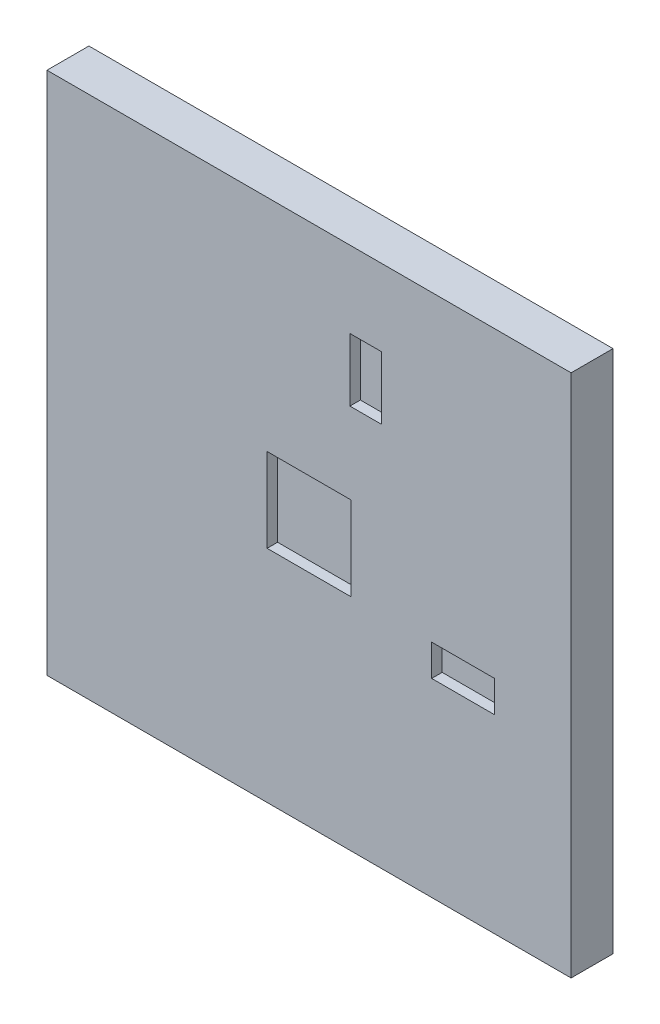
ISO-10303-21;
HEADER;
FILE_DESCRIPTION(('STEP AP214'),'2;1');
FILE_NAME('part.step','',(''),(''),'','','');
FILE_SCHEMA(('AUTOMOTIVE_DESIGN { 1 0 10303 214 1 1 1 1 }'));
ENDSEC;
DATA;
#1=APPLICATION_CONTEXT('core data for automotive mechanical design processes');
#2=APPLICATION_PROTOCOL_DEFINITION('international standard','automotive_design',2000,#1);
#3=PRODUCT_CONTEXT('',#1,'mechanical');
#4=PRODUCT('Part','Part','',(#3));
#5=PRODUCT_RELATED_PRODUCT_CATEGORY('part','',(#4));
#6=PRODUCT_DEFINITION_FORMATION('','',#4);
#7=PRODUCT_DEFINITION_CONTEXT('part definition',#1,'design');
#8=PRODUCT_DEFINITION('design','',#6,#7);
#9=PRODUCT_DEFINITION_SHAPE('','',#8);
#10=(LENGTH_UNIT() NAMED_UNIT(*) SI_UNIT(.MILLI.,.METRE.));
#11=(NAMED_UNIT(*) PLANE_ANGLE_UNIT() SI_UNIT($,.RADIAN.));
#12=(NAMED_UNIT(*) SI_UNIT($,.STERADIAN.) SOLID_ANGLE_UNIT());
#13=UNCERTAINTY_MEASURE_WITH_UNIT(LENGTH_MEASURE(1.E-05),#10,'distance_accuracy_value','');
#14=(GEOMETRIC_REPRESENTATION_CONTEXT(3) GLOBAL_UNCERTAINTY_ASSIGNED_CONTEXT((#13)) GLOBAL_UNIT_ASSIGNED_CONTEXT((#10,
#11,#12)) REPRESENTATION_CONTEXT('',''));
#15=CARTESIAN_POINT('',(0.,0.,0.));
#16=DIRECTION('',(0.,0.,1.));
#17=DIRECTION('',(1.,0.,0.));
#18=AXIS2_PLACEMENT_3D('',#15,#16,#17);
#19=CARTESIAN_POINT('',(147.048407602462,-195.903707865169,20.));
#20=DIRECTION('',(-1.,0.,0.));
#21=DIRECTION('',(0.,0.,1.));
#22=AXIS2_PLACEMENT_3D('',#19,#20,#21);
#23=PLANE('',#22);
#24=DIRECTION('',(0.,1.,0.));
#25=VECTOR('',#24,1.);
#26=CARTESIAN_POINT('',(147.048407602462,-195.903707865169,0.));
#27=LINE('',#26,#25);
#28=CARTESIAN_POINT('',(147.048407602462,-195.903707865169,0.));
#29=VERTEX_POINT('',#28);
#30=CARTESIAN_POINT('',(147.048407602462,54.0962921348315,0.));
#31=VERTEX_POINT('',#30);
#32=EDGE_CURVE('E198',#29,#31,#27,.T.);
#33=ORIENTED_EDGE('',*,*,#32,.T.);
#34=DIRECTION('',(0.,0.,-1.));
#35=VECTOR('',#34,1.);
#36=CARTESIAN_POINT('',(147.048407602462,54.0962921348315,20.));
#37=LINE('',#36,#35);
#38=CARTESIAN_POINT('',(147.048407602462,54.0962921348315,20.));
#39=VERTEX_POINT('',#38);
#40=EDGE_CURVE('E11',#39,#31,#37,.T.);
#41=ORIENTED_EDGE('',*,*,#40,.F.);
#42=DIRECTION('',(0.,1.,0.));
#43=VECTOR('',#42,1.);
#44=CARTESIAN_POINT('',(147.048407602462,-195.903707865169,20.));
#45=LINE('',#44,#43);
#46=CARTESIAN_POINT('',(147.048407602462,-195.903707865169,20.));
#47=VERTEX_POINT('',#46);
#48=EDGE_CURVE('E289',#47,#39,#45,.T.);
#49=ORIENTED_EDGE('',*,*,#48,.F.);
#50=DIRECTION('',(0.,0.,-1.));
#51=VECTOR('',#50,1.);
#52=CARTESIAN_POINT('',(147.048407602462,-195.903707865169,20.));
#53=LINE('',#52,#51);
#54=EDGE_CURVE('E303',#47,#29,#53,.T.);
#55=ORIENTED_EDGE('',*,*,#54,.T.);
#56=EDGE_LOOP('',(#33,#41,#49,#55));
#57=FACE_BOUND('',#56,.T.);
#58=ADVANCED_FACE('F39',(#57),#23,.F.);
#59=CARTESIAN_POINT('',(147.048407602462,54.0962921348315,20.));
#60=DIRECTION('',(0.,-1.,0.));
#61=DIRECTION('',(1.,0.,0.));
#62=AXIS2_PLACEMENT_3D('',#59,#60,#61);
#63=PLANE('',#62);
#64=DIRECTION('',(-1.,0.,0.));
#65=VECTOR('',#64,1.);
#66=CARTESIAN_POINT('',(147.048407602462,54.0962921348315,0.));
#67=LINE('',#66,#65);
#68=CARTESIAN_POINT('',(-102.951592397538,54.0962921348315,0.));
#69=VERTEX_POINT('',#68);
#70=EDGE_CURVE('E307',#31,#69,#67,.T.);
#71=ORIENTED_EDGE('',*,*,#70,.T.);
#72=DIRECTION('',(0.,0.,-1.));
#73=VECTOR('',#72,1.);
#74=CARTESIAN_POINT('',(-102.951592397538,54.0962921348315,20.));
#75=LINE('',#74,#73);
#76=CARTESIAN_POINT('',(-102.951592397538,54.0962921348315,20.));
#77=VERTEX_POINT('',#76);
#78=EDGE_CURVE('E47',#77,#69,#75,.T.);
#79=ORIENTED_EDGE('',*,*,#78,.F.);
#80=DIRECTION('',(-1.,0.,0.));
#81=VECTOR('',#80,1.);
#82=CARTESIAN_POINT('',(147.048407602462,54.0962921348315,20.));
#83=LINE('',#82,#81);
#84=EDGE_CURVE('E293',#39,#77,#83,.T.);
#85=ORIENTED_EDGE('',*,*,#84,.F.);
#86=ORIENTED_EDGE('',*,*,#40,.T.);
#87=EDGE_LOOP('',(#71,#79,#85,#86));
#88=FACE_BOUND('',#87,.T.);
#89=ADVANCED_FACE('F343',(#88),#63,.F.);
#90=CARTESIAN_POINT('',(-102.951592397538,-195.903707865169,20.));
#91=DIRECTION('',(1.,0.,0.));
#92=DIRECTION('',(0.,0.,-1.));
#93=AXIS2_PLACEMENT_3D('',#90,#91,#92);
#94=PLANE('',#93);
#95=DIRECTION('',(0.,-1.,0.));
#96=VECTOR('',#95,1.);
#97=CARTESIAN_POINT('',(-102.951592397538,-195.903707865169,0.));
#98=LINE('',#97,#96);
#99=CARTESIAN_POINT('',(-102.951592397538,-195.903707865169,0.));
#100=VERTEX_POINT('',#99);
#101=EDGE_CURVE('E310',#69,#100,#98,.T.);
#102=ORIENTED_EDGE('',*,*,#101,.T.);
#103=DIRECTION('',(0.,0.,-1.));
#104=VECTOR('',#103,1.);
#105=CARTESIAN_POINT('',(-102.951592397538,-195.903707865169,20.));
#106=LINE('',#105,#104);
#107=CARTESIAN_POINT('',(-102.951592397538,-195.903707865169,20.));
#108=VERTEX_POINT('',#107);
#109=EDGE_CURVE('E318',#108,#100,#106,.T.);
#110=ORIENTED_EDGE('',*,*,#109,.F.);
#111=DIRECTION('',(0.,-1.,0.));
#112=VECTOR('',#111,1.);
#113=CARTESIAN_POINT('',(-102.951592397538,-195.903707865169,20.));
#114=LINE('',#113,#112);
#115=EDGE_CURVE('E297',#77,#108,#114,.T.);
#116=ORIENTED_EDGE('',*,*,#115,.F.);
#117=ORIENTED_EDGE('',*,*,#78,.T.);
#118=EDGE_LOOP('',(#102,#110,#116,#117));
#119=FACE_BOUND('',#118,.T.);
#120=ADVANCED_FACE('F327',(#119),#94,.F.);
#121=CARTESIAN_POINT('',(147.048407602462,-195.903707865169,20.));
#122=DIRECTION('',(0.,1.,0.));
#123=DIRECTION('',(-1.,0.,0.));
#124=AXIS2_PLACEMENT_3D('',#121,#122,#123);
#125=PLANE('',#124);
#126=DIRECTION('',(1.,0.,0.));
#127=VECTOR('',#126,1.);
#128=CARTESIAN_POINT('',(147.048407602462,-195.903707865169,0.));
#129=LINE('',#128,#127);
#130=EDGE_CURVE('E294',#100,#29,#129,.T.);
#131=ORIENTED_EDGE('',*,*,#130,.T.);
#132=ORIENTED_EDGE('',*,*,#54,.F.);
#133=DIRECTION('',(1.,0.,0.));
#134=VECTOR('',#133,1.);
#135=CARTESIAN_POINT('',(147.048407602462,-195.903707865169,20.));
#136=LINE('',#135,#134);
#137=EDGE_CURVE('E300',#108,#47,#136,.T.);
#138=ORIENTED_EDGE('',*,*,#137,.F.);
#139=ORIENTED_EDGE('',*,*,#109,.T.);
#140=EDGE_LOOP('',(#131,#132,#138,#139));
#141=FACE_BOUND('',#140,.T.);
#142=ADVANCED_FACE('F336',(#141),#125,.F.);
#143=CARTESIAN_POINT('',(0.,0.,20.));
#144=DIRECTION('',(0.,0.,1.));
#145=DIRECTION('',(1.,0.,0.));
#146=AXIS2_PLACEMENT_3D('',#143,#144,#145);
#147=PLANE('',#146);
#148=DIRECTION('',(0.,-1.,0.));
#149=VECTOR('',#148,1.);
#150=CARTESIAN_POINT('',(41.5484076024617,17.5962921348315,20.));
#151=LINE('',#150,#149);
#152=CARTESIAN_POINT('',(41.5484076024617,17.5962921348315,20.));
#153=VERTEX_POINT('',#152);
#154=CARTESIAN_POINT('',(41.5484076024618,-12.4037078651685,20.));
#155=VERTEX_POINT('',#154);
#156=EDGE_CURVE('E54',#153,#155,#151,.T.);
#157=ORIENTED_EDGE('',*,*,#156,.F.);
#158=DIRECTION('',(-1.,0.,0.));
#159=VECTOR('',#158,1.);
#160=CARTESIAN_POINT('',(41.5484076024617,17.5962921348315,20.));
#161=LINE('',#160,#159);
#162=CARTESIAN_POINT('',(56.5484076024617,17.5962921348315,20.));
#163=VERTEX_POINT('',#162);
#164=EDGE_CURVE('E175',#163,#153,#161,.T.);
#165=ORIENTED_EDGE('',*,*,#164,.F.);
#166=DIRECTION('',(0.,1.,0.));
#167=VECTOR('',#166,1.);
#168=CARTESIAN_POINT('',(56.5484076024617,17.5962921348315,20.));
#169=LINE('',#168,#167);
#170=CARTESIAN_POINT('',(56.5484076024618,-12.4037078651685,20.));
#171=VERTEX_POINT('',#170);
#172=EDGE_CURVE('E179',#171,#163,#169,.T.);
#173=ORIENTED_EDGE('',*,*,#172,.F.);
#174=DIRECTION('',(1.,0.,0.));
#175=VECTOR('',#174,1.);
#176=CARTESIAN_POINT('',(41.5484076024618,-12.4037078651685,20.));
#177=LINE('',#176,#175);
#178=EDGE_CURVE('E188',#155,#171,#177,.T.);
#179=ORIENTED_EDGE('',*,*,#178,.F.);
#180=EDGE_LOOP('',(#157,#165,#173,#179));
#181=FACE_BOUND('',#180,.T.);
#182=DIRECTION('',(0.,-1.,0.));
#183=VECTOR('',#182,1.);
#184=CARTESIAN_POINT('',(80.5484076024617,-105.403707865169,20.));
#185=LINE('',#184,#183);
#186=CARTESIAN_POINT('',(80.5484076024617,-90.4037078651685,20.));
#187=VERTEX_POINT('',#186);
#188=CARTESIAN_POINT('',(80.5484076024617,-105.403707865169,20.));
#189=VERTEX_POINT('',#188);
#190=EDGE_CURVE('E62',#187,#189,#185,.T.);
#191=ORIENTED_EDGE('',*,*,#190,.F.);
#192=DIRECTION('',(-1.,0.,0.));
#193=VECTOR('',#192,1.);
#194=CARTESIAN_POINT('',(80.5484076024617,-90.4037078651685,20.));
#195=LINE('',#194,#193);
#196=CARTESIAN_POINT('',(110.548407602462,-90.4037078651685,20.));
#197=VERTEX_POINT('',#196);
#198=EDGE_CURVE('E209',#197,#187,#195,.T.);
#199=ORIENTED_EDGE('',*,*,#198,.F.);
#200=DIRECTION('',(0.,1.,0.));
#201=VECTOR('',#200,1.);
#202=CARTESIAN_POINT('',(110.548407602462,-105.403707865169,20.));
#203=LINE('',#202,#201);
#204=CARTESIAN_POINT('',(110.548407602462,-105.403707865169,20.));
#205=VERTEX_POINT('',#204);
#206=EDGE_CURVE('E229',#205,#197,#203,.T.);
#207=ORIENTED_EDGE('',*,*,#206,.F.);
#208=DIRECTION('',(1.,0.,0.));
#209=VECTOR('',#208,1.);
#210=CARTESIAN_POINT('',(80.5484076024617,-105.403707865169,20.));
#211=LINE('',#210,#209);
#212=EDGE_CURVE('E224',#189,#205,#211,.T.);
#213=ORIENTED_EDGE('',*,*,#212,.F.);
#214=EDGE_LOOP('',(#191,#199,#207,#213));
#215=FACE_BOUND('',#214,.T.);
#216=DIRECTION('',(0.,-1.,0.));
#217=VECTOR('',#216,1.);
#218=CARTESIAN_POINT('',(2.04840760246174,-50.9037078651685,20.));
#219=LINE('',#218,#217);
#220=CARTESIAN_POINT('',(2.04840760246174,-50.9037078651685,20.));
#221=VERTEX_POINT('',#220);
#222=CARTESIAN_POINT('',(2.04840760246174,-90.9037078651685,20.));
#223=VERTEX_POINT('',#222);
#224=EDGE_CURVE('E264',#221,#223,#219,.T.);
#225=ORIENTED_EDGE('',*,*,#224,.F.);
#226=DIRECTION('',(-1.,0.,0.));
#227=VECTOR('',#226,1.);
#228=CARTESIAN_POINT('',(2.04840760246174,-50.9037078651685,20.));
#229=LINE('',#228,#227);
#230=CARTESIAN_POINT('',(42.0484076024617,-50.9037078651685,20.));
#231=VERTEX_POINT('',#230);
#232=EDGE_CURVE('E251',#231,#221,#229,.T.);
#233=ORIENTED_EDGE('',*,*,#232,.F.);
#234=DIRECTION('',(0.,1.,0.));
#235=VECTOR('',#234,1.);
#236=CARTESIAN_POINT('',(42.0484076024617,-50.9037078651685,20.));
#237=LINE('',#236,#235);
#238=CARTESIAN_POINT('',(42.0484076024617,-90.9037078651685,20.));
#239=VERTEX_POINT('',#238);
#240=EDGE_CURVE('E271',#239,#231,#237,.T.);
#241=ORIENTED_EDGE('',*,*,#240,.F.);
#242=DIRECTION('',(1.,0.,0.));
#243=VECTOR('',#242,1.);
#244=CARTESIAN_POINT('',(2.04840760246174,-90.9037078651685,20.));
#245=LINE('',#244,#243);
#246=EDGE_CURVE('E267',#223,#239,#245,.T.);
#247=ORIENTED_EDGE('',*,*,#246,.F.);
#248=EDGE_LOOP('',(#225,#233,#241,#247));
#249=FACE_BOUND('',#248,.T.);
#250=ORIENTED_EDGE('',*,*,#48,.T.);
#251=ORIENTED_EDGE('',*,*,#84,.T.);
#252=ORIENTED_EDGE('',*,*,#115,.T.);
#253=ORIENTED_EDGE('',*,*,#137,.T.);
#254=EDGE_LOOP('',(#250,#251,#252,#253));
#255=FACE_BOUND('',#254,.T.);
#256=ADVANCED_FACE('F342',(#181,#215,#249,#255),#147,.T.);
#257=CARTESIAN_POINT('',(0.,0.,0.));
#258=DIRECTION('',(0.,0.,1.));
#259=DIRECTION('',(1.,0.,0.));
#260=AXIS2_PLACEMENT_3D('',#257,#258,#259);
#261=PLANE('',#260);
#262=ORIENTED_EDGE('',*,*,#32,.F.);
#263=ORIENTED_EDGE('',*,*,#130,.F.);
#264=ORIENTED_EDGE('',*,*,#101,.F.);
#265=ORIENTED_EDGE('',*,*,#70,.F.);
#266=EDGE_LOOP('',(#262,#263,#264,#265));
#267=FACE_BOUND('',#266,.T.);
#268=ADVANCED_FACE('F333',(#267),#261,.F.);
#269=CARTESIAN_POINT('',(2.04840760246174,-50.9037078651685,15.));
#270=DIRECTION('',(-1.,0.,0.));
#271=DIRECTION('',(0.,-1.,0.));
#272=AXIS2_PLACEMENT_3D('',#269,#270,#271);
#273=PLANE('',#272);
#274=ORIENTED_EDGE('',*,*,#224,.T.);
#275=DIRECTION('',(0.,0.,1.));
#276=VECTOR('',#275,1.);
#277=CARTESIAN_POINT('',(2.04840760246174,-90.9037078651685,15.));
#278=LINE('',#277,#276);
#279=CARTESIAN_POINT('',(2.04840760246174,-90.9037078651685,15.));
#280=VERTEX_POINT('',#279);
#281=EDGE_CURVE('E263',#280,#223,#278,.T.);
#282=ORIENTED_EDGE('',*,*,#281,.F.);
#283=DIRECTION('',(0.,-1.,0.));
#284=VECTOR('',#283,1.);
#285=CARTESIAN_POINT('',(2.04840760246174,-50.9037078651685,15.));
#286=LINE('',#285,#284);
#287=CARTESIAN_POINT('',(2.04840760246174,-50.9037078651685,15.));
#288=VERTEX_POINT('',#287);
#289=EDGE_CURVE('E246',#288,#280,#286,.T.);
#290=ORIENTED_EDGE('',*,*,#289,.F.);
#291=DIRECTION('',(0.,0.,1.));
#292=VECTOR('',#291,1.);
#293=CARTESIAN_POINT('',(2.04840760246174,-50.9037078651685,15.));
#294=LINE('',#293,#292);
#295=EDGE_CURVE('E225',#288,#221,#294,.T.);
#296=ORIENTED_EDGE('',*,*,#295,.T.);
#297=EDGE_LOOP('',(#274,#282,#290,#296));
#298=FACE_BOUND('',#297,.T.);
#299=ADVANCED_FACE('F355',(#298),#273,.F.);
#300=CARTESIAN_POINT('',(2.04840760246174,-50.9037078651685,15.));
#301=DIRECTION('',(0.,1.,0.));
#302=DIRECTION('',(-1.,0.,0.));
#303=AXIS2_PLACEMENT_3D('',#300,#301,#302);
#304=PLANE('',#303);
#305=ORIENTED_EDGE('',*,*,#232,.T.);
#306=ORIENTED_EDGE('',*,*,#295,.F.);
#307=DIRECTION('',(-1.,0.,0.));
#308=VECTOR('',#307,1.);
#309=CARTESIAN_POINT('',(2.04840760246174,-50.9037078651685,15.));
#310=LINE('',#309,#308);
#311=CARTESIAN_POINT('',(42.0484076024617,-50.9037078651685,15.));
#312=VERTEX_POINT('',#311);
#313=EDGE_CURVE('E259',#312,#288,#310,.T.);
#314=ORIENTED_EDGE('',*,*,#313,.F.);
#315=DIRECTION('',(0.,0.,1.));
#316=VECTOR('',#315,1.);
#317=CARTESIAN_POINT('',(42.0484076024617,-50.9037078651685,15.));
#318=LINE('',#317,#316);
#319=EDGE_CURVE('E280',#312,#231,#318,.T.);
#320=ORIENTED_EDGE('',*,*,#319,.T.);
#321=EDGE_LOOP('',(#305,#306,#314,#320));
#322=FACE_BOUND('',#321,.T.);
#323=ADVANCED_FACE('F361',(#322),#304,.F.);
#324=CARTESIAN_POINT('',(42.0484076024617,-50.9037078651685,15.));
#325=DIRECTION('',(1.,0.,0.));
#326=DIRECTION('',(0.,1.,0.));
#327=AXIS2_PLACEMENT_3D('',#324,#325,#326);
#328=PLANE('',#327);
#329=ORIENTED_EDGE('',*,*,#240,.T.);
#330=ORIENTED_EDGE('',*,*,#319,.F.);
#331=DIRECTION('',(0.,1.,0.));
#332=VECTOR('',#331,1.);
#333=CARTESIAN_POINT('',(42.0484076024617,-50.9037078651685,15.));
#334=LINE('',#333,#332);
#335=CARTESIAN_POINT('',(42.0484076024617,-90.9037078651685,15.));
#336=VERTEX_POINT('',#335);
#337=EDGE_CURVE('E255',#336,#312,#334,.T.);
#338=ORIENTED_EDGE('',*,*,#337,.F.);
#339=DIRECTION('',(0.,0.,1.));
#340=VECTOR('',#339,1.);
#341=CARTESIAN_POINT('',(42.0484076024617,-90.9037078651685,15.));
#342=LINE('',#341,#340);
#343=EDGE_CURVE('E283',#336,#239,#342,.T.);
#344=ORIENTED_EDGE('',*,*,#343,.T.);
#345=EDGE_LOOP('',(#329,#330,#338,#344));
#346=FACE_BOUND('',#345,.T.);
#347=ADVANCED_FACE('F367',(#346),#328,.F.);
#348=CARTESIAN_POINT('',(2.04840760246174,-90.9037078651685,15.));
#349=DIRECTION('',(0.,-1.,0.));
#350=DIRECTION('',(0.,0.,-1.));
#351=AXIS2_PLACEMENT_3D('',#348,#349,#350);
#352=PLANE('',#351);
#353=ORIENTED_EDGE('',*,*,#246,.T.);
#354=ORIENTED_EDGE('',*,*,#343,.F.);
#355=DIRECTION('',(1.,0.,0.));
#356=VECTOR('',#355,1.);
#357=CARTESIAN_POINT('',(2.04840760246174,-90.9037078651685,15.));
#358=LINE('',#357,#356);
#359=EDGE_CURVE('E250',#280,#336,#358,.T.);
#360=ORIENTED_EDGE('',*,*,#359,.F.);
#361=ORIENTED_EDGE('',*,*,#281,.T.);
#362=EDGE_LOOP('',(#353,#354,#360,#361));
#363=FACE_BOUND('',#362,.T.);
#364=ADVANCED_FACE('F363',(#363),#352,.F.);
#365=CARTESIAN_POINT('',(0.,0.,15.));
#366=DIRECTION('',(0.,0.,1.));
#367=DIRECTION('',(1.,0.,0.));
#368=AXIS2_PLACEMENT_3D('',#365,#366,#367);
#369=PLANE('',#368);
#370=ORIENTED_EDGE('',*,*,#289,.T.);
#371=ORIENTED_EDGE('',*,*,#359,.T.);
#372=ORIENTED_EDGE('',*,*,#337,.T.);
#373=ORIENTED_EDGE('',*,*,#313,.T.);
#374=EDGE_LOOP('',(#370,#371,#372,#373));
#375=FACE_BOUND('',#374,.T.);
#376=ADVANCED_FACE('F366',(#375),#369,.T.);
#377=CARTESIAN_POINT('',(80.5484076024617,-105.403707865169,15.));
#378=DIRECTION('',(-1.,0.,0.));
#379=DIRECTION('',(0.,0.,1.));
#380=AXIS2_PLACEMENT_3D('',#377,#378,#379);
#381=PLANE('',#380);
#382=ORIENTED_EDGE('',*,*,#190,.T.);
#383=DIRECTION('',(0.,0.,1.));
#384=VECTOR('',#383,1.);
#385=CARTESIAN_POINT('',(80.5484076024617,-105.403707865169,15.));
#386=LINE('',#385,#384);
#387=CARTESIAN_POINT('',(80.5484076024617,-105.403707865169,15.));
#388=VERTEX_POINT('',#387);
#389=EDGE_CURVE('E221',#388,#189,#386,.T.);
#390=ORIENTED_EDGE('',*,*,#389,.F.);
#391=DIRECTION('',(0.,-1.,0.));
#392=VECTOR('',#391,1.);
#393=CARTESIAN_POINT('',(80.5484076024617,-105.403707865169,15.));
#394=LINE('',#393,#392);
#395=CARTESIAN_POINT('',(80.5484076024617,-90.4037078651685,15.));
#396=VERTEX_POINT('',#395);
#397=EDGE_CURVE('E204',#396,#388,#394,.T.);
#398=ORIENTED_EDGE('',*,*,#397,.F.);
#399=DIRECTION('',(0.,0.,1.));
#400=VECTOR('',#399,1.);
#401=CARTESIAN_POINT('',(80.5484076024617,-90.4037078651685,15.));
#402=LINE('',#401,#400);
#403=EDGE_CURVE('E189',#396,#187,#402,.T.);
#404=ORIENTED_EDGE('',*,*,#403,.T.);
#405=EDGE_LOOP('',(#382,#390,#398,#404));
#406=FACE_BOUND('',#405,.T.);
#407=ADVANCED_FACE('F377',(#406),#381,.F.);
#408=CARTESIAN_POINT('',(80.5484076024617,-90.4037078651685,15.));
#409=DIRECTION('',(0.,1.,0.));
#410=DIRECTION('',(0.,0.,1.));
#411=AXIS2_PLACEMENT_3D('',#408,#409,#410);
#412=PLANE('',#411);
#413=ORIENTED_EDGE('',*,*,#198,.T.);
#414=ORIENTED_EDGE('',*,*,#403,.F.);
#415=DIRECTION('',(-1.,0.,0.));
#416=VECTOR('',#415,1.);
#417=CARTESIAN_POINT('',(80.5484076024617,-90.4037078651685,15.));
#418=LINE('',#417,#416);
#419=CARTESIAN_POINT('',(110.548407602462,-90.4037078651685,15.));
#420=VERTEX_POINT('',#419);
#421=EDGE_CURVE('E217',#420,#396,#418,.T.);
#422=ORIENTED_EDGE('',*,*,#421,.F.);
#423=DIRECTION('',(0.,0.,1.));
#424=VECTOR('',#423,1.);
#425=CARTESIAN_POINT('',(110.548407602462,-90.4037078651685,15.));
#426=LINE('',#425,#424);
#427=EDGE_CURVE('E238',#420,#197,#426,.T.);
#428=ORIENTED_EDGE('',*,*,#427,.T.);
#429=EDGE_LOOP('',(#413,#414,#422,#428));
#430=FACE_BOUND('',#429,.T.);
#431=ADVANCED_FACE('F381',(#430),#412,.F.);
#432=CARTESIAN_POINT('',(110.548407602462,-105.403707865169,15.));
#433=DIRECTION('',(1.,0.,0.));
#434=DIRECTION('',(0.,0.,-1.));
#435=AXIS2_PLACEMENT_3D('',#432,#433,#434);
#436=PLANE('',#435);
#437=ORIENTED_EDGE('',*,*,#206,.T.);
#438=ORIENTED_EDGE('',*,*,#427,.F.);
#439=DIRECTION('',(0.,1.,0.));
#440=VECTOR('',#439,1.);
#441=CARTESIAN_POINT('',(110.548407602462,-105.403707865169,15.));
#442=LINE('',#441,#440);
#443=CARTESIAN_POINT('',(110.548407602462,-105.403707865169,15.));
#444=VERTEX_POINT('',#443);
#445=EDGE_CURVE('E213',#444,#420,#442,.T.);
#446=ORIENTED_EDGE('',*,*,#445,.F.);
#447=DIRECTION('',(0.,0.,1.));
#448=VECTOR('',#447,1.);
#449=CARTESIAN_POINT('',(110.548407602462,-105.403707865169,15.));
#450=LINE('',#449,#448);
#451=EDGE_CURVE('E241',#444,#205,#450,.T.);
#452=ORIENTED_EDGE('',*,*,#451,.T.);
#453=EDGE_LOOP('',(#437,#438,#446,#452));
#454=FACE_BOUND('',#453,.T.);
#455=ADVANCED_FACE('F386',(#454),#436,.F.);
#456=CARTESIAN_POINT('',(80.5484076024617,-105.403707865169,15.));
#457=DIRECTION('',(0.,-1.,0.));
#458=DIRECTION('',(0.,0.,-1.));
#459=AXIS2_PLACEMENT_3D('',#456,#457,#458);
#460=PLANE('',#459);
#461=ORIENTED_EDGE('',*,*,#212,.T.);
#462=ORIENTED_EDGE('',*,*,#451,.F.);
#463=DIRECTION('',(1.,0.,0.));
#464=VECTOR('',#463,1.);
#465=CARTESIAN_POINT('',(80.5484076024617,-105.403707865169,15.));
#466=LINE('',#465,#464);
#467=EDGE_CURVE('E208',#388,#444,#466,.T.);
#468=ORIENTED_EDGE('',*,*,#467,.F.);
#469=ORIENTED_EDGE('',*,*,#389,.T.);
#470=EDGE_LOOP('',(#461,#462,#468,#469));
#471=FACE_BOUND('',#470,.T.);
#472=ADVANCED_FACE('F382',(#471),#460,.F.);
#473=CARTESIAN_POINT('',(0.,0.,15.));
#474=DIRECTION('',(0.,0.,-1.));
#475=DIRECTION('',(-1.,0.,0.));
#476=AXIS2_PLACEMENT_3D('',#473,#474,#475);
#477=PLANE('',#476);
#478=ORIENTED_EDGE('',*,*,#397,.T.);
#479=ORIENTED_EDGE('',*,*,#467,.T.);
#480=ORIENTED_EDGE('',*,*,#445,.T.);
#481=ORIENTED_EDGE('',*,*,#421,.T.);
#482=EDGE_LOOP('',(#478,#479,#480,#481));
#483=FACE_BOUND('',#482,.T.);
#484=ADVANCED_FACE('F385',(#483),#477,.F.);
#485=CARTESIAN_POINT('',(41.5484076024617,17.5962921348315,15.));
#486=DIRECTION('',(-1.,0.,0.));
#487=DIRECTION('',(0.,-1.,0.));
#488=AXIS2_PLACEMENT_3D('',#485,#486,#487);
#489=PLANE('',#488);
#490=ORIENTED_EDGE('',*,*,#156,.T.);
#491=DIRECTION('',(0.,0.,1.));
#492=VECTOR('',#491,1.);
#493=CARTESIAN_POINT('',(41.5484076024618,-12.4037078651685,15.));
#494=LINE('',#493,#492);
#495=CARTESIAN_POINT('',(41.5484076024618,-12.4037078651685,15.));
#496=VERTEX_POINT('',#495);
#497=EDGE_CURVE('E150',#496,#155,#494,.T.);
#498=ORIENTED_EDGE('',*,*,#497,.F.);
#499=DIRECTION('',(0.,-1.,0.));
#500=VECTOR('',#499,1.);
#501=CARTESIAN_POINT('',(41.5484076024617,17.5962921348315,15.));
#502=LINE('',#501,#500);
#503=CARTESIAN_POINT('',(41.5484076024617,17.5962921348315,15.));
#504=VERTEX_POINT('',#503);
#505=EDGE_CURVE('E154',#504,#496,#502,.T.);
#506=ORIENTED_EDGE('',*,*,#505,.F.);
#507=DIRECTION('',(0.,0.,1.));
#508=VECTOR('',#507,1.);
#509=CARTESIAN_POINT('',(41.5484076024617,17.5962921348315,15.));
#510=LINE('',#509,#508);
#511=EDGE_CURVE('E195',#504,#153,#510,.T.);
#512=ORIENTED_EDGE('',*,*,#511,.T.);
#513=EDGE_LOOP('',(#490,#498,#506,#512));
#514=FACE_BOUND('',#513,.T.);
#515=ADVANCED_FACE('F152',(#514),#489,.F.);
#516=CARTESIAN_POINT('',(41.5484076024617,17.5962921348315,15.));
#517=DIRECTION('',(0.,1.,0.));
#518=DIRECTION('',(0.,0.,1.));
#519=AXIS2_PLACEMENT_3D('',#516,#517,#518);
#520=PLANE('',#519);
#521=ORIENTED_EDGE('',*,*,#164,.T.);
#522=ORIENTED_EDGE('',*,*,#511,.F.);
#523=DIRECTION('',(-1.,0.,0.));
#524=VECTOR('',#523,1.);
#525=CARTESIAN_POINT('',(41.5484076024617,17.5962921348315,15.));
#526=LINE('',#525,#524);
#527=CARTESIAN_POINT('',(56.5484076024617,17.5962921348315,15.));
#528=VERTEX_POINT('',#527);
#529=EDGE_CURVE('E161',#528,#504,#526,.T.);
#530=ORIENTED_EDGE('',*,*,#529,.F.);
#531=DIRECTION('',(0.,0.,1.));
#532=VECTOR('',#531,1.);
#533=CARTESIAN_POINT('',(56.5484076024617,17.5962921348315,15.));
#534=LINE('',#533,#532);
#535=EDGE_CURVE('E199',#528,#163,#534,.T.);
#536=ORIENTED_EDGE('',*,*,#535,.T.);
#537=EDGE_LOOP('',(#521,#522,#530,#536));
#538=FACE_BOUND('',#537,.T.);
#539=ADVANCED_FACE('F399',(#538),#520,.F.);
#540=CARTESIAN_POINT('',(56.5484076024617,17.5962921348315,15.));
#541=DIRECTION('',(1.,0.,0.));
#542=DIRECTION('',(0.,1.,0.));
#543=AXIS2_PLACEMENT_3D('',#540,#541,#542);
#544=PLANE('',#543);
#545=ORIENTED_EDGE('',*,*,#172,.T.);
#546=ORIENTED_EDGE('',*,*,#535,.F.);
#547=DIRECTION('',(0.,1.,0.));
#548=VECTOR('',#547,1.);
#549=CARTESIAN_POINT('',(56.5484076024617,17.5962921348315,15.));
#550=LINE('',#549,#548);
#551=CARTESIAN_POINT('',(56.5484076024618,-12.4037078651685,15.));
#552=VERTEX_POINT('',#551);
#553=EDGE_CURVE('E170',#552,#528,#550,.T.);
#554=ORIENTED_EDGE('',*,*,#553,.F.);
#555=DIRECTION('',(0.,0.,1.));
#556=VECTOR('',#555,1.);
#557=CARTESIAN_POINT('',(56.5484076024618,-12.4037078651685,15.));
#558=LINE('',#557,#556);
#559=EDGE_CURVE('E160',#552,#171,#558,.T.);
#560=ORIENTED_EDGE('',*,*,#559,.T.);
#561=EDGE_LOOP('',(#545,#546,#554,#560));
#562=FACE_BOUND('',#561,.T.);
#563=ADVANCED_FACE('F402',(#562),#544,.F.);
#564=CARTESIAN_POINT('',(41.5484076024618,-12.4037078651685,15.));
#565=DIRECTION('',(0.,-1.,0.));
#566=DIRECTION('',(0.,0.,-1.));
#567=AXIS2_PLACEMENT_3D('',#564,#565,#566);
#568=PLANE('',#567);
#569=ORIENTED_EDGE('',*,*,#178,.T.);
#570=ORIENTED_EDGE('',*,*,#559,.F.);
#571=DIRECTION('',(1.,0.,0.));
#572=VECTOR('',#571,1.);
#573=CARTESIAN_POINT('',(41.5484076024618,-12.4037078651685,15.));
#574=LINE('',#573,#572);
#575=EDGE_CURVE('E164',#496,#552,#574,.T.);
#576=ORIENTED_EDGE('',*,*,#575,.F.);
#577=ORIENTED_EDGE('',*,*,#497,.T.);
#578=EDGE_LOOP('',(#569,#570,#576,#577));
#579=FACE_BOUND('',#578,.T.);
#580=ADVANCED_FACE('F165',(#579),#568,.F.);
#581=CARTESIAN_POINT('',(0.,0.,15.));
#582=DIRECTION('',(0.,0.,1.));
#583=DIRECTION('',(1.,0.,0.));
#584=AXIS2_PLACEMENT_3D('',#581,#582,#583);
#585=PLANE('',#584);
#586=ORIENTED_EDGE('',*,*,#505,.T.);
#587=ORIENTED_EDGE('',*,*,#575,.T.);
#588=ORIENTED_EDGE('',*,*,#553,.T.);
#589=ORIENTED_EDGE('',*,*,#529,.T.);
#590=EDGE_LOOP('',(#586,#587,#588,#589));
#591=FACE_BOUND('',#590,.T.);
#592=ADVANCED_FACE('F172',(#591),#585,.T.);
#593=CLOSED_SHELL('',(#58,#89,#120,#142,#256,#268,#299,#323,#347,#364,#376,#407,#431,#455,#472,
#484,#515,#539,#563,#580,#592));
#594=MANIFOLD_SOLID_BREP('B2',#593);
#595=ADVANCED_BREP_SHAPE_REPRESENTATION('',(#18,#594),#14);
#596=SHAPE_DEFINITION_REPRESENTATION(#9,#595);
ENDSEC;
END-ISO-10303-21;
